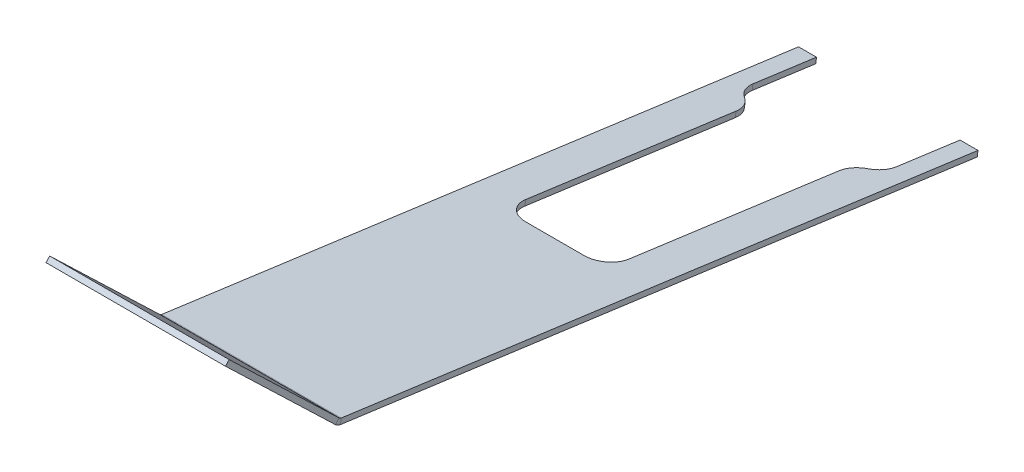
ISO-10303-21;
HEADER;
FILE_DESCRIPTION(('STEP AP214'),'2;1');
FILE_NAME('part.step','',(''),(''),'','','');
FILE_SCHEMA(('AUTOMOTIVE_DESIGN { 1 0 10303 214 1 1 1 1 }'));
ENDSEC;
DATA;
#1=APPLICATION_CONTEXT('core data for automotive mechanical design processes');
#2=APPLICATION_PROTOCOL_DEFINITION('international standard','automotive_design',2000,#1);
#3=PRODUCT_CONTEXT('',#1,'mechanical');
#4=PRODUCT('Part','Part','',(#3));
#5=PRODUCT_RELATED_PRODUCT_CATEGORY('part','',(#4));
#6=PRODUCT_DEFINITION_FORMATION('','',#4);
#7=PRODUCT_DEFINITION_CONTEXT('part definition',#1,'design');
#8=PRODUCT_DEFINITION('design','',#6,#7);
#9=PRODUCT_DEFINITION_SHAPE('','',#8);
#10=(LENGTH_UNIT() NAMED_UNIT(*) SI_UNIT(.MILLI.,.METRE.));
#11=(NAMED_UNIT(*) PLANE_ANGLE_UNIT() SI_UNIT($,.RADIAN.));
#12=(NAMED_UNIT(*) SI_UNIT($,.STERADIAN.) SOLID_ANGLE_UNIT());
#13=UNCERTAINTY_MEASURE_WITH_UNIT(LENGTH_MEASURE(1.E-05),#10,'distance_accuracy_value','');
#14=(GEOMETRIC_REPRESENTATION_CONTEXT(3) GLOBAL_UNCERTAINTY_ASSIGNED_CONTEXT((#13)) GLOBAL_UNIT_ASSIGNED_CONTEXT((#10,
#11,#12)) REPRESENTATION_CONTEXT('',''));
#15=CARTESIAN_POINT('',(0.,0.,0.));
#16=DIRECTION('',(0.,0.,1.));
#17=DIRECTION('',(1.,0.,0.));
#18=AXIS2_PLACEMENT_3D('',#15,#16,#17);
#19=CARTESIAN_POINT('',(100.,-120.,-125.));
#20=DIRECTION('',(0.,0.990872403181699,-0.134803117964402));
#21=DIRECTION('',(0.,0.134803117964402,0.990872403181699));
#22=AXIS2_PLACEMENT_3D('',#19,#20,#21);
#23=PLANE('',#22);
#24=DIRECTION('',(-1.,0.,0.));
#25=VECTOR('',#24,1.);
#26=CARTESIAN_POINT('',(100.,-216.999999999994,-838.));
#27=LINE('',#26,#25);
#28=CARTESIAN_POINT('',(-80.,-216.999999999994,-838.));
#29=VERTEX_POINT('',#28);
#30=CARTESIAN_POINT('',(-100.,-216.999999999994,-838.));
#31=VERTEX_POINT('',#30);
#32=EDGE_CURVE('E322',#29,#31,#27,.T.);
#33=ORIENTED_EDGE('',*,*,#32,.F.);
#34=DIRECTION('',(0.,0.134803117964402,0.990872403181699));
#35=VECTOR('',#34,1.);
#36=CARTESIAN_POINT('',(-80.,-120.,-125.));
#37=LINE('',#36,#35);
#38=CARTESIAN_POINT('',(-80.,-207.361577065539,-767.152623172509));
#39=VERTEX_POINT('',#38);
#40=EDGE_CURVE('E242',#29,#39,#37,.T.);
#41=ORIENTED_EDGE('',*,*,#40,.T.);
#42=CARTESIAN_POINT('',(-55.,-207.361577065539,-767.152623172508));
#43=DIRECTION('',(0.,0.990872403181699,-0.134803117964402));
#44=DIRECTION('',(0.,0.134803117964402,0.990872403181699));
#45=AXIS2_PLACEMENT_3D('',#42,#43,#44);
#46=CIRCLE('',#45,25.);
#47=CARTESIAN_POINT('',(-68.75,-204.547007079787,-746.464082967958));
#48=VERTEX_POINT('',#47);
#49=EDGE_CURVE('E245',#39,#48,#46,.T.);
#50=ORIENTED_EDGE('',*,*,#49,.T.);
#51=CARTESIAN_POINT('',(-82.5,-201.732437094035,-725.775542763407));
#52=DIRECTION('',(0.,0.990872403181699,-0.134803117964402));
#53=DIRECTION('',(0.,0.134803117964402,0.990872403181699));
#54=AXIS2_PLACEMENT_3D('',#51,#52,#53);
#55=CIRCLE('',#54,25.);
#56=CARTESIAN_POINT('',(-57.5,-201.732437094035,-725.775542763407));
#57=VERTEX_POINT('',#56);
#58=EDGE_CURVE('E248',#57,#48,#55,.T.);
#59=ORIENTED_EDGE('',*,*,#58,.F.);
#60=DIRECTION('',(0.,0.134803117964402,0.990872403181699));
#61=VECTOR('',#60,1.);
#62=CARTESIAN_POINT('',(-57.4999999999999,-120.,-125.));
#63=LINE('',#62,#61);
#64=CARTESIAN_POINT('',(-57.5,-169.818908712453,-491.194658886405));
#65=VERTEX_POINT('',#64);
#66=EDGE_CURVE('E182',#57,#65,#63,.T.);
#67=ORIENTED_EDGE('',*,*,#66,.T.);
#68=CARTESIAN_POINT('',(-32.5,-169.818908712453,-491.194658886405));
#69=DIRECTION('',(0.,0.990872403181699,-0.134803117964402));
#70=DIRECTION('',(0.,0.134803117964402,0.990872403181699));
#71=AXIS2_PLACEMENT_3D('',#68,#69,#70);
#72=CIRCLE('',#71,25.);
#73=CARTESIAN_POINT('',(-32.4999999999999,-166.448830763343,-466.422848806863));
#74=VERTEX_POINT('',#73);
#75=EDGE_CURVE('E344',#65,#74,#72,.T.);
#76=ORIENTED_EDGE('',*,*,#75,.T.);
#77=DIRECTION('',(1.,0.,0.));
#78=VECTOR('',#77,1.);
#79=CARTESIAN_POINT('',(100.,-166.448830763343,-466.422848806863));
#80=LINE('',#79,#78);
#81=CARTESIAN_POINT('',(32.5,-166.448830763343,-466.422848806863));
#82=VERTEX_POINT('',#81);
#83=EDGE_CURVE('E251',#74,#82,#80,.T.);
#84=ORIENTED_EDGE('',*,*,#83,.T.);
#85=CARTESIAN_POINT('',(32.5,-169.818908712453,-491.194658886405));
#86=DIRECTION('',(0.,0.990872403181699,-0.134803117964402));
#87=DIRECTION('',(0.,0.134803117964402,0.990872403181699));
#88=AXIS2_PLACEMENT_3D('',#85,#86,#87);
#89=CIRCLE('',#88,25.);
#90=CARTESIAN_POINT('',(57.5,-169.818908712453,-491.194658886405));
#91=VERTEX_POINT('',#90);
#92=EDGE_CURVE('E11',#82,#91,#89,.T.);
#93=ORIENTED_EDGE('',*,*,#92,.T.);
#94=DIRECTION('',(0.,0.134803117964402,0.990872403181699));
#95=VECTOR('',#94,1.);
#96=CARTESIAN_POINT('',(57.5000000000001,-120.,-125.));
#97=LINE('',#96,#95);
#98=CARTESIAN_POINT('',(57.5,-201.732437094035,-725.775542763407));
#99=VERTEX_POINT('',#98);
#100=EDGE_CURVE('E253',#99,#91,#97,.T.);
#101=ORIENTED_EDGE('',*,*,#100,.F.);
#102=CARTESIAN_POINT('',(82.5,-201.732437094035,-725.775542763407));
#103=DIRECTION('',(0.,0.990872403181699,-0.134803117964402));
#104=DIRECTION('',(0.,0.134803117964402,0.990872403181699));
#105=AXIS2_PLACEMENT_3D('',#102,#103,#104);
#106=CIRCLE('',#105,25.0000000000001);
#107=CARTESIAN_POINT('',(68.75,-204.547007079787,-746.464082967958));
#108=VERTEX_POINT('',#107);
#109=EDGE_CURVE('E185',#99,#108,#106,.F.);
#110=ORIENTED_EDGE('',*,*,#109,.T.);
#111=CARTESIAN_POINT('',(55.,-207.361577065539,-767.152623172508));
#112=DIRECTION('',(0.,0.990872403181699,-0.134803117964402));
#113=DIRECTION('',(0.,0.134803117964402,0.990872403181699));
#114=AXIS2_PLACEMENT_3D('',#111,#112,#113);
#115=CIRCLE('',#114,25.);
#116=CARTESIAN_POINT('',(80.,-207.361577065539,-767.152623172508));
#117=VERTEX_POINT('',#116);
#118=EDGE_CURVE('E238',#117,#108,#115,.F.);
#119=ORIENTED_EDGE('',*,*,#118,.F.);
#120=DIRECTION('',(0.,0.134803117964402,0.990872403181699));
#121=VECTOR('',#120,1.);
#122=CARTESIAN_POINT('',(80.,-120.,-125.));
#123=LINE('',#122,#121);
#124=CARTESIAN_POINT('',(80.,-216.999999999994,-838.));
#125=VERTEX_POINT('',#124);
#126=EDGE_CURVE('E240',#125,#117,#123,.T.);
#127=ORIENTED_EDGE('',*,*,#126,.F.);
#128=CARTESIAN_POINT('',(100.,-216.999999999994,-838.));
#129=VERTEX_POINT('',#128);
#130=EDGE_CURVE('E323',#129,#125,#27,.T.);
#131=ORIENTED_EDGE('',*,*,#130,.F.);
#132=DIRECTION('',(0.,-0.134803117964402,-0.990872403181699));
#133=VECTOR('',#132,1.);
#134=CARTESIAN_POINT('',(100.,-120.,-125.));
#135=LINE('',#134,#133);
#136=CARTESIAN_POINT('',(100.,-120.439089748205,-128.22753598423));
#137=VERTEX_POINT('',#136);
#138=EDGE_CURVE('E256',#137,#129,#135,.T.);
#139=ORIENTED_EDGE('',*,*,#138,.F.);
#140=DIRECTION('',(-1.,0.,0.));
#141=VECTOR('',#140,1.);
#142=CARTESIAN_POINT('',(100.,-120.439089748205,-128.22753598423));
#143=LINE('',#142,#141);
#144=CARTESIAN_POINT('',(-100.,-120.439089748205,-128.22753598423));
#145=VERTEX_POINT('',#144);
#146=EDGE_CURVE('E280',#137,#145,#143,.T.);
#147=ORIENTED_EDGE('',*,*,#146,.T.);
#148=DIRECTION('',(0.,-0.134803117964402,-0.990872403181699));
#149=VECTOR('',#148,1.);
#150=CARTESIAN_POINT('',(-100.,-120.,-125.));
#151=LINE('',#150,#149);
#152=EDGE_CURVE('E255',#145,#31,#151,.T.);
#153=ORIENTED_EDGE('',*,*,#152,.T.);
#154=EDGE_LOOP('',(#33,#41,#50,#59,#67,#76,#84,#93,#101,#110,#119,#127,#131,#139,#147,#153));
#155=FACE_BOUND('',#154,.T.);
#156=ADVANCED_FACE('F38',(#155),#23,.F.);
#157=CARTESIAN_POINT('',(100.,-211.054765580903,-838.808818707786));
#158=DIRECTION('',(0.,-0.134803117964414,-0.990872403181697));
#159=DIRECTION('',(0.,0.990872403181697,-0.134803117964414));
#160=AXIS2_PLACEMENT_3D('',#157,#158,#159);
#161=PLANE('',#160);
#162=ORIENTED_EDGE('',*,*,#130,.T.);
#163=DIRECTION('',(0.,0.990872403181699,-0.134803117964402));
#164=VECTOR('',#163,1.);
#165=CARTESIAN_POINT('',(80.,-328.933913762255,-822.771964046369));
#166=LINE('',#165,#164);
#167=CARTESIAN_POINT('',(80.,-211.054765580903,-838.808818707786));
#168=VERTEX_POINT('',#167);
#169=EDGE_CURVE('E228',#125,#168,#166,.T.);
#170=ORIENTED_EDGE('',*,*,#169,.T.);
#171=DIRECTION('',(-1.,0.,0.));
#172=VECTOR('',#171,1.);
#173=CARTESIAN_POINT('',(100.,-211.054765580903,-838.808818707786));
#174=LINE('',#173,#172);
#175=CARTESIAN_POINT('',(100.,-211.054765580903,-838.808818707786));
#176=VERTEX_POINT('',#175);
#177=EDGE_CURVE('E319',#176,#168,#174,.T.);
#178=ORIENTED_EDGE('',*,*,#177,.F.);
#179=DIRECTION('',(0.,-0.990872403181697,0.134803117964414));
#180=VECTOR('',#179,1.);
#181=CARTESIAN_POINT('',(100.,-211.054765580903,-838.808818707786));
#182=LINE('',#181,#180);
#183=EDGE_CURVE('E258',#176,#129,#182,.T.);
#184=ORIENTED_EDGE('',*,*,#183,.T.);
#185=EDGE_LOOP('',(#162,#170,#178,#184));
#186=FACE_BOUND('',#185,.T.);
#187=ADVANCED_FACE('F369',(#186),#161,.T.);
#188=CARTESIAN_POINT('',(100.,-114.05476558091,-125.808818707786));
#189=DIRECTION('',(0.,0.990872403181699,-0.134803117964402));
#190=DIRECTION('',(0.,0.134803117964402,0.990872403181699));
#191=AXIS2_PLACEMENT_3D('',#188,#189,#190);
#192=PLANE('',#191);
#193=DIRECTION('',(0.,0.134803117964402,0.990872403181699));
#194=VECTOR('',#193,1.);
#195=CARTESIAN_POINT('',(-80.,-211.054765580903,-838.808818707786));
#196=LINE('',#195,#194);
#197=CARTESIAN_POINT('',(-80.,-211.054765580903,-838.808818707786));
#198=VERTEX_POINT('',#197);
#199=CARTESIAN_POINT('',(-80.,-201.416342646449,-767.961441880295));
#200=VERTEX_POINT('',#199);
#201=EDGE_CURVE('E209',#198,#200,#196,.T.);
#202=ORIENTED_EDGE('',*,*,#201,.F.);
#203=CARTESIAN_POINT('',(-100.,-211.054765580903,-838.808818707786));
#204=VERTEX_POINT('',#203);
#205=EDGE_CURVE('E318',#198,#204,#174,.T.);
#206=ORIENTED_EDGE('',*,*,#205,.T.);
#207=DIRECTION('',(0.,-0.134803117964402,-0.990872403181699));
#208=VECTOR('',#207,1.);
#209=CARTESIAN_POINT('',(-100.,-114.05476558091,-125.808818707786));
#210=LINE('',#209,#208);
#211=CARTESIAN_POINT('',(-100.,-114.493855329115,-129.036354692016));
#212=VERTEX_POINT('',#211);
#213=EDGE_CURVE('E286',#212,#204,#210,.T.);
#214=ORIENTED_EDGE('',*,*,#213,.F.);
#215=DIRECTION('',(-1.,0.,0.));
#216=VECTOR('',#215,1.);
#217=CARTESIAN_POINT('',(100.,-114.493855329115,-129.036354692016));
#218=LINE('',#217,#216);
#219=CARTESIAN_POINT('',(100.,-114.493855329115,-129.036354692016));
#220=VERTEX_POINT('',#219);
#221=EDGE_CURVE('E315',#220,#212,#218,.T.);
#222=ORIENTED_EDGE('',*,*,#221,.F.);
#223=DIRECTION('',(0.,-0.134803117964402,-0.990872403181699));
#224=VECTOR('',#223,1.);
#225=CARTESIAN_POINT('',(100.,-114.05476558091,-125.808818707786));
#226=LINE('',#225,#224);
#227=EDGE_CURVE('E262',#220,#176,#226,.T.);
#228=ORIENTED_EDGE('',*,*,#227,.T.);
#229=ORIENTED_EDGE('',*,*,#177,.T.);
#230=DIRECTION('',(0.,0.134803117964402,0.990872403181699));
#231=VECTOR('',#230,1.);
#232=CARTESIAN_POINT('',(80.,-211.054765580903,-838.808818707786));
#233=LINE('',#232,#231);
#234=CARTESIAN_POINT('',(80.,-201.416342646449,-767.961441880295));
#235=VERTEX_POINT('',#234);
#236=EDGE_CURVE('E212',#168,#235,#233,.T.);
#237=ORIENTED_EDGE('',*,*,#236,.T.);
#238=CARTESIAN_POINT('',(55.,-201.416342646449,-767.961441880295));
#239=DIRECTION('',(0.,-0.990872403181699,0.134803117964402));
#240=DIRECTION('',(0.,-0.134803117964402,-0.990872403181699));
#241=AXIS2_PLACEMENT_3D('',#238,#239,#240);
#242=CIRCLE('',#241,25.);
#243=CARTESIAN_POINT('',(68.75,-198.601772660697,-747.272901675744));
#244=VERTEX_POINT('',#243);
#245=EDGE_CURVE('E215',#235,#244,#242,.T.);
#246=ORIENTED_EDGE('',*,*,#245,.T.);
#247=CARTESIAN_POINT('',(82.5,-195.787202674944,-726.584361471194));
#248=DIRECTION('',(0.,-0.990872403181699,0.134803117964402));
#249=DIRECTION('',(0.,-0.134803117964402,-0.990872403181699));
#250=AXIS2_PLACEMENT_3D('',#247,#248,#249);
#251=CIRCLE('',#250,25.0000000000001);
#252=CARTESIAN_POINT('',(57.5,-195.787202674944,-726.584361471194));
#253=VERTEX_POINT('',#252);
#254=EDGE_CURVE('E218',#253,#244,#251,.T.);
#255=ORIENTED_EDGE('',*,*,#254,.F.);
#256=DIRECTION('',(0.,0.134803117964402,0.990872403181699));
#257=VECTOR('',#256,1.);
#258=CARTESIAN_POINT('',(57.5,-195.787202674944,-726.584361471194));
#259=LINE('',#258,#257);
#260=CARTESIAN_POINT('',(57.5,-163.873674293363,-492.003477594192));
#261=VERTEX_POINT('',#260);
#262=EDGE_CURVE('E204',#253,#261,#259,.T.);
#263=ORIENTED_EDGE('',*,*,#262,.T.);
#264=CARTESIAN_POINT('',(32.5,-163.873674293363,-492.003477594192));
#265=DIRECTION('',(0.,0.990872403181699,-0.134803117964402));
#266=DIRECTION('',(0.,0.134803117964402,0.990872403181699));
#267=AXIS2_PLACEMENT_3D('',#264,#265,#266);
#268=CIRCLE('',#267,25.);
#269=CARTESIAN_POINT('',(32.5,-160.503596344253,-467.231667514649));
#270=VERTEX_POINT('',#269);
#271=EDGE_CURVE('E46',#261,#270,#268,.F.);
#272=ORIENTED_EDGE('',*,*,#271,.T.);
#273=DIRECTION('',(1.,0.,0.));
#274=VECTOR('',#273,1.);
#275=CARTESIAN_POINT('',(-57.5,-160.503596344253,-467.231667514649));
#276=LINE('',#275,#274);
#277=CARTESIAN_POINT('',(-32.5,-160.503596344253,-467.231667514649));
#278=VERTEX_POINT('',#277);
#279=EDGE_CURVE('E201',#278,#270,#276,.T.);
#280=ORIENTED_EDGE('',*,*,#279,.F.);
#281=CARTESIAN_POINT('',(-32.5,-163.873674293363,-492.003477594192));
#282=DIRECTION('',(0.,0.990872403181699,-0.134803117964402));
#283=DIRECTION('',(0.,0.134803117964402,0.990872403181699));
#284=AXIS2_PLACEMENT_3D('',#281,#282,#283);
#285=CIRCLE('',#284,25.);
#286=CARTESIAN_POINT('',(-57.5,-163.873674293363,-492.003477594192));
#287=VERTEX_POINT('',#286);
#288=EDGE_CURVE('E200',#278,#287,#285,.F.);
#289=ORIENTED_EDGE('',*,*,#288,.T.);
#290=DIRECTION('',(0.,0.134803117964402,0.990872403181699));
#291=VECTOR('',#290,1.);
#292=CARTESIAN_POINT('',(-57.5,-195.787202674944,-726.584361471194));
#293=LINE('',#292,#291);
#294=CARTESIAN_POINT('',(-57.5,-195.787202674944,-726.584361471194));
#295=VERTEX_POINT('',#294);
#296=EDGE_CURVE('E179',#295,#287,#293,.T.);
#297=ORIENTED_EDGE('',*,*,#296,.F.);
#298=CARTESIAN_POINT('',(-82.5,-195.787202674944,-726.584361471194));
#299=DIRECTION('',(0.,0.990872403181699,-0.134803117964402));
#300=DIRECTION('',(0.,0.134803117964402,0.990872403181699));
#301=AXIS2_PLACEMENT_3D('',#298,#299,#300);
#302=CIRCLE('',#301,25.);
#303=CARTESIAN_POINT('',(-68.75,-198.601772660697,-747.272901675744));
#304=VERTEX_POINT('',#303);
#305=EDGE_CURVE('E189',#295,#304,#302,.T.);
#306=ORIENTED_EDGE('',*,*,#305,.T.);
#307=CARTESIAN_POINT('',(-55.,-201.416342646449,-767.961441880295));
#308=DIRECTION('',(0.,0.990872403181699,-0.134803117964402));
#309=DIRECTION('',(0.,0.134803117964402,0.990872403181699));
#310=AXIS2_PLACEMENT_3D('',#307,#308,#309);
#311=CIRCLE('',#310,25.);
#312=EDGE_CURVE('E195',#200,#304,#311,.T.);
#313=ORIENTED_EDGE('',*,*,#312,.F.);
#314=EDGE_LOOP('',(#202,#206,#214,#222,#228,#229,#237,#246,#255,#263,#272,#280,#289,#297,#306,#313));
#315=FACE_BOUND('',#314,.T.);
#316=ADVANCED_FACE('F198',(#315),#192,.T.);
#317=CARTESIAN_POINT('',(100.,-117.744238926698,-122.650248881977));
#318=DIRECTION('',(1.,0.,0.));
#319=DIRECTION('',(0.,0.,-1.));
#320=AXIS2_PLACEMENT_3D('',#317,#318,#319);
#321=PLANE('',#320);
#322=DIRECTION('',(0.,0.721387321030954,-0.692531828189711));
#323=VECTOR('',#322,1.);
#324=CARTESIAN_POINT('',(100.,-117.744238926698,-122.650248881977));
#325=LINE('',#324,#323);
#326=CARTESIAN_POINT('',(100.,-117.744238926698,-122.650248881977));
#327=VERTEX_POINT('',#326);
#328=CARTESIAN_POINT('',(100.,-113.415915000512,-126.805439851115));
#329=VERTEX_POINT('',#328);
#330=EDGE_CURVE('E332',#327,#329,#325,.T.);
#331=ORIENTED_EDGE('',*,*,#330,.F.);
#332=CARTESIAN_POINT('',(100.,-110.530365716388,-129.575567163874));
#333=DIRECTION('',(-1.,0.,0.));
#334=DIRECTION('',(0.,0.,1.));
#335=AXIS2_PLACEMENT_3D('',#332,#333,#334);
#336=CIRCLE('',#335,10.);
#337=EDGE_CURVE('E277',#327,#137,#336,.F.);
#338=ORIENTED_EDGE('',*,*,#337,.T.);
#339=DIRECTION('',(0.,-0.990872403181699,0.1348031179644));
#340=VECTOR('',#339,1.);
#341=CARTESIAN_POINT('',(100.,-114.493855329115,-129.036354692016));
#342=LINE('',#341,#340);
#343=EDGE_CURVE('E330',#220,#137,#342,.T.);
#344=ORIENTED_EDGE('',*,*,#343,.F.);
#345=CARTESIAN_POINT('',(100.,-110.530365716388,-129.575567163874));
#346=DIRECTION('',(1.,0.,0.));
#347=DIRECTION('',(0.,0.,-1.));
#348=AXIS2_PLACEMENT_3D('',#345,#346,#347);
#349=CIRCLE('',#348,4.);
#350=EDGE_CURVE('E265',#329,#220,#349,.T.);
#351=ORIENTED_EDGE('',*,*,#350,.F.);
#352=EDGE_LOOP('',(#331,#338,#344,#351));
#353=FACE_BOUND('',#352,.T.);
#354=ADVANCED_FACE('F382',(#353),#321,.T.);
#355=CARTESIAN_POINT('',(100.,-114.493855329115,-129.036354692016));
#356=DIRECTION('',(1.,0.,0.));
#357=DIRECTION('',(0.,0.,-1.));
#358=AXIS2_PLACEMENT_3D('',#355,#356,#357);
#359=PLANE('',#358);
#360=DIRECTION('',(0.,-0.692531828189713,-0.721387321030952));
#361=VECTOR('',#360,1.);
#362=CARTESIAN_POINT('',(100.,0.,0.));
#363=LINE('',#362,#361);
#364=CARTESIAN_POINT('',(100.,0.,0.));
#365=VERTEX_POINT('',#364);
#366=EDGE_CURVE('E274',#365,#327,#363,.T.);
#367=ORIENTED_EDGE('',*,*,#366,.T.);
#368=ORIENTED_EDGE('',*,*,#330,.T.);
#369=DIRECTION('',(0.,-0.692531828189713,-0.721387321030952));
#370=VECTOR('',#369,1.);
#371=CARTESIAN_POINT('',(100.,4.32832392618571,-4.15519096913828));
#372=LINE('',#371,#370);
#373=CARTESIAN_POINT('',(100.,4.32832392618571,-4.15519096913828));
#374=VERTEX_POINT('',#373);
#375=EDGE_CURVE('E268',#374,#329,#372,.T.);
#376=ORIENTED_EDGE('',*,*,#375,.F.);
#377=DIRECTION('',(0.,0.721387321030952,-0.692531828189713));
#378=VECTOR('',#377,1.);
#379=CARTESIAN_POINT('',(100.,0.,0.));
#380=LINE('',#379,#378);
#381=EDGE_CURVE('E271',#365,#374,#380,.T.);
#382=ORIENTED_EDGE('',*,*,#381,.F.);
#383=EDGE_LOOP('',(#367,#368,#376,#382));
#384=FACE_BOUND('',#383,.T.);
#385=ADVANCED_FACE('F389',(#384),#359,.T.);
#386=CARTESIAN_POINT('',(-100.,-120.439089748205,-128.22753598423));
#387=DIRECTION('',(-1.,0.,0.));
#388=DIRECTION('',(0.,0.,1.));
#389=AXIS2_PLACEMENT_3D('',#386,#387,#388);
#390=PLANE('',#389);
#391=DIRECTION('',(0.,0.990872403181699,-0.1348031179644));
#392=VECTOR('',#391,1.);
#393=CARTESIAN_POINT('',(-100.,-120.439089748205,-128.22753598423));
#394=LINE('',#393,#392);
#395=EDGE_CURVE('E328',#145,#212,#394,.T.);
#396=ORIENTED_EDGE('',*,*,#395,.F.);
#397=CARTESIAN_POINT('',(-100.,-110.530365716388,-129.575567163874));
#398=DIRECTION('',(-1.,0.,0.));
#399=DIRECTION('',(0.,0.,1.));
#400=AXIS2_PLACEMENT_3D('',#397,#398,#399);
#401=CIRCLE('',#400,10.);
#402=CARTESIAN_POINT('',(-100.,-117.744238926698,-122.650248881977));
#403=VERTEX_POINT('',#402);
#404=EDGE_CURVE('E259',#403,#145,#401,.F.);
#405=ORIENTED_EDGE('',*,*,#404,.F.);
#406=DIRECTION('',(0.,-0.721387321030954,0.692531828189711));
#407=VECTOR('',#406,1.);
#408=CARTESIAN_POINT('',(-100.,-113.415915000512,-126.805439851115));
#409=LINE('',#408,#407);
#410=CARTESIAN_POINT('',(-100.,-113.415915000512,-126.805439851115));
#411=VERTEX_POINT('',#410);
#412=EDGE_CURVE('E326',#411,#403,#409,.T.);
#413=ORIENTED_EDGE('',*,*,#412,.F.);
#414=CARTESIAN_POINT('',(-100.,-110.530365716388,-129.575567163874));
#415=DIRECTION('',(1.,0.,0.));
#416=DIRECTION('',(0.,0.,-1.));
#417=AXIS2_PLACEMENT_3D('',#414,#415,#416);
#418=CIRCLE('',#417,4.);
#419=EDGE_CURVE('E289',#411,#212,#418,.T.);
#420=ORIENTED_EDGE('',*,*,#419,.T.);
#421=EDGE_LOOP('',(#396,#405,#413,#420));
#422=FACE_BOUND('',#421,.T.);
#423=ADVANCED_FACE('F434',(#422),#390,.T.);
#424=CARTESIAN_POINT('',(-100.,-113.415915000512,-126.805439851115));
#425=DIRECTION('',(-1.,0.,0.));
#426=DIRECTION('',(0.,0.,1.));
#427=AXIS2_PLACEMENT_3D('',#424,#425,#426);
#428=PLANE('',#427);
#429=ORIENTED_EDGE('',*,*,#152,.F.);
#430=ORIENTED_EDGE('',*,*,#395,.T.);
#431=ORIENTED_EDGE('',*,*,#213,.T.);
#432=DIRECTION('',(0.,-0.990872403181697,0.134803117964414));
#433=VECTOR('',#432,1.);
#434=CARTESIAN_POINT('',(-100.,-211.054765580903,-838.808818707786));
#435=LINE('',#434,#433);
#436=EDGE_CURVE('E283',#204,#31,#435,.T.);
#437=ORIENTED_EDGE('',*,*,#436,.T.);
#438=EDGE_LOOP('',(#429,#430,#431,#437));
#439=FACE_BOUND('',#438,.T.);
#440=ADVANCED_FACE('F405',(#439),#428,.T.);
#441=DIRECTION('',(0.,0.990872403181699,-0.134803117964402));
#442=VECTOR('',#441,1.);
#443=CARTESIAN_POINT('',(-80.,-328.933913762255,-822.771964046369));
#444=LINE('',#443,#442);
#445=EDGE_CURVE('E231',#29,#198,#444,.T.);
#446=ORIENTED_EDGE('',*,*,#445,.F.);
#447=ORIENTED_EDGE('',*,*,#32,.T.);
#448=ORIENTED_EDGE('',*,*,#436,.F.);
#449=ORIENTED_EDGE('',*,*,#205,.F.);
#450=EDGE_LOOP('',(#446,#447,#448,#449));
#451=FACE_BOUND('',#450,.T.);
#452=ADVANCED_FACE('F410',(#451),#161,.T.);
#453=CARTESIAN_POINT('',(100.,-110.530365716388,-129.575567163874));
#454=DIRECTION('',(-1.,0.,0.));
#455=DIRECTION('',(0.,0.,1.));
#456=AXIS2_PLACEMENT_3D('',#453,#454,#455);
#457=CYLINDRICAL_SURFACE('',#456,4.);
#458=ORIENTED_EDGE('',*,*,#419,.F.);
#459=DIRECTION('',(-1.,0.,0.));
#460=VECTOR('',#459,1.);
#461=CARTESIAN_POINT('',(100.,-113.415915000512,-126.805439851115));
#462=LINE('',#461,#460);
#463=EDGE_CURVE('E312',#329,#411,#462,.T.);
#464=ORIENTED_EDGE('',*,*,#463,.F.);
#465=ORIENTED_EDGE('',*,*,#350,.T.);
#466=ORIENTED_EDGE('',*,*,#221,.T.);
#467=EDGE_LOOP('',(#458,#464,#465,#466));
#468=FACE_BOUND('',#467,.T.);
#469=ADVANCED_FACE('F378',(#468),#457,.F.);
#470=CARTESIAN_POINT('',(100.,4.32832392618571,-4.15519096913828));
#471=DIRECTION('',(0.,0.721387321030952,-0.692531828189713));
#472=DIRECTION('',(0.,0.692531828189713,0.721387321030952));
#473=AXIS2_PLACEMENT_3D('',#470,#471,#472);
#474=PLANE('',#473);
#475=DIRECTION('',(0.,-0.692531828189713,-0.721387321030952));
#476=VECTOR('',#475,1.);
#477=CARTESIAN_POINT('',(-100.,4.32832392618571,-4.15519096913828));
#478=LINE('',#477,#476);
#479=CARTESIAN_POINT('',(-100.,4.32832392618571,-4.15519096913828));
#480=VERTEX_POINT('',#479);
#481=EDGE_CURVE('E292',#480,#411,#478,.T.);
#482=ORIENTED_EDGE('',*,*,#481,.F.);
#483=DIRECTION('',(-1.,0.,0.));
#484=VECTOR('',#483,1.);
#485=CARTESIAN_POINT('',(100.,4.32832392618571,-4.15519096913828));
#486=LINE('',#485,#484);
#487=EDGE_CURVE('E310',#374,#480,#486,.T.);
#488=ORIENTED_EDGE('',*,*,#487,.F.);
#489=ORIENTED_EDGE('',*,*,#375,.T.);
#490=ORIENTED_EDGE('',*,*,#463,.T.);
#491=EDGE_LOOP('',(#482,#488,#489,#490));
#492=FACE_BOUND('',#491,.T.);
#493=ADVANCED_FACE('F386',(#492),#474,.T.);
#494=CARTESIAN_POINT('',(100.,0.,0.));
#495=DIRECTION('',(0.,0.692531828189713,0.721387321030952));
#496=DIRECTION('',(0.,-0.721387321030952,0.692531828189713));
#497=AXIS2_PLACEMENT_3D('',#494,#495,#496);
#498=PLANE('',#497);
#499=DIRECTION('',(0.,0.721387321030952,-0.692531828189713));
#500=VECTOR('',#499,1.);
#501=CARTESIAN_POINT('',(-100.,0.,0.));
#502=LINE('',#501,#500);
#503=CARTESIAN_POINT('',(-100.,0.,0.));
#504=VERTEX_POINT('',#503);
#505=EDGE_CURVE('E295',#504,#480,#502,.T.);
#506=ORIENTED_EDGE('',*,*,#505,.F.);
#507=DIRECTION('',(-1.,0.,0.));
#508=VECTOR('',#507,1.);
#509=CARTESIAN_POINT('',(100.,0.,0.));
#510=LINE('',#509,#508);
#511=EDGE_CURVE('E308',#365,#504,#510,.T.);
#512=ORIENTED_EDGE('',*,*,#511,.F.);
#513=ORIENTED_EDGE('',*,*,#381,.T.);
#514=ORIENTED_EDGE('',*,*,#487,.T.);
#515=EDGE_LOOP('',(#506,#512,#513,#514));
#516=FACE_BOUND('',#515,.T.);
#517=ADVANCED_FACE('F392',(#516),#498,.T.);
#518=CARTESIAN_POINT('',(100.,0.,0.));
#519=DIRECTION('',(0.,0.721387321030952,-0.692531828189713));
#520=DIRECTION('',(0.,0.692531828189713,0.721387321030952));
#521=AXIS2_PLACEMENT_3D('',#518,#519,#520);
#522=PLANE('',#521);
#523=DIRECTION('',(0.,-0.692531828189713,-0.721387321030952));
#524=VECTOR('',#523,1.);
#525=CARTESIAN_POINT('',(-100.,0.,0.));
#526=LINE('',#525,#524);
#527=EDGE_CURVE('E298',#504,#403,#526,.T.);
#528=ORIENTED_EDGE('',*,*,#527,.T.);
#529=DIRECTION('',(-1.,0.,0.));
#530=VECTOR('',#529,1.);
#531=CARTESIAN_POINT('',(100.,-117.744238926698,-122.650248881977));
#532=LINE('',#531,#530);
#533=EDGE_CURVE('E305',#327,#403,#532,.T.);
#534=ORIENTED_EDGE('',*,*,#533,.F.);
#535=ORIENTED_EDGE('',*,*,#366,.F.);
#536=ORIENTED_EDGE('',*,*,#511,.T.);
#537=EDGE_LOOP('',(#528,#534,#535,#536));
#538=FACE_BOUND('',#537,.T.);
#539=ADVANCED_FACE('F397',(#538),#522,.F.);
#540=CARTESIAN_POINT('',(100.,-110.530365716388,-129.575567163874));
#541=DIRECTION('',(-1.,0.,0.));
#542=DIRECTION('',(0.,0.,1.));
#543=AXIS2_PLACEMENT_3D('',#540,#541,#542);
#544=CYLINDRICAL_SURFACE('',#543,10.);
#545=ORIENTED_EDGE('',*,*,#404,.T.);
#546=ORIENTED_EDGE('',*,*,#146,.F.);
#547=ORIENTED_EDGE('',*,*,#337,.F.);
#548=ORIENTED_EDGE('',*,*,#533,.T.);
#549=EDGE_LOOP('',(#545,#546,#547,#548));
#550=FACE_BOUND('',#549,.T.);
#551=ADVANCED_FACE('F402',(#550),#544,.T.);
#552=CARTESIAN_POINT('',(100.,-110.530365716388,-129.575567163874));
#553=DIRECTION('',(1.,0.,0.));
#554=DIRECTION('',(0.,0.,-1.));
#555=AXIS2_PLACEMENT_3D('',#552,#553,#554);
#556=PLANE('',#555);
#557=ORIENTED_EDGE('',*,*,#138,.T.);
#558=ORIENTED_EDGE('',*,*,#183,.F.);
#559=ORIENTED_EDGE('',*,*,#227,.F.);
#560=ORIENTED_EDGE('',*,*,#343,.T.);
#561=EDGE_LOOP('',(#557,#558,#559,#560));
#562=FACE_BOUND('',#561,.T.);
#563=ADVANCED_FACE('F373',(#562),#556,.T.);
#564=CARTESIAN_POINT('',(-100.,-110.530365716388,-129.575567163874));
#565=DIRECTION('',(1.,0.,0.));
#566=DIRECTION('',(0.,0.,-1.));
#567=AXIS2_PLACEMENT_3D('',#564,#565,#566);
#568=PLANE('',#567);
#569=ORIENTED_EDGE('',*,*,#481,.T.);
#570=ORIENTED_EDGE('',*,*,#412,.T.);
#571=ORIENTED_EDGE('',*,*,#527,.F.);
#572=ORIENTED_EDGE('',*,*,#505,.T.);
#573=EDGE_LOOP('',(#569,#570,#571,#572));
#574=FACE_BOUND('',#573,.T.);
#575=ADVANCED_FACE('F494',(#574),#568,.F.);
#576=CARTESIAN_POINT('',(57.5,-313.666350856296,-710.547506809777));
#577=DIRECTION('',(-1.,0.,0.));
#578=DIRECTION('',(0.,0.,1.));
#579=AXIS2_PLACEMENT_3D('',#576,#577,#578);
#580=PLANE('',#579);
#581=ORIENTED_EDGE('',*,*,#100,.T.);
#582=DIRECTION('',(0.,0.990872403181699,-0.134803117964402));
#583=VECTOR('',#582,1.);
#584=CARTESIAN_POINT('',(57.5,-281.752822474715,-475.966622932775));
#585=LINE('',#584,#583);
#586=EDGE_CURVE('E341',#91,#261,#585,.T.);
#587=ORIENTED_EDGE('',*,*,#586,.T.);
#588=ORIENTED_EDGE('',*,*,#262,.F.);
#589=DIRECTION('',(0.,0.990872403181699,-0.134803117964402));
#590=VECTOR('',#589,1.);
#591=CARTESIAN_POINT('',(57.5,-313.666350856296,-710.547506809777));
#592=LINE('',#591,#590);
#593=EDGE_CURVE('E221',#99,#253,#592,.T.);
#594=ORIENTED_EDGE('',*,*,#593,.F.);
#595=EDGE_LOOP('',(#581,#587,#588,#594));
#596=FACE_BOUND('',#595,.T.);
#597=ADVANCED_FACE('F352',(#596),#580,.T.);
#598=CARTESIAN_POINT('',(-57.5,-278.382744525605,-451.194812853232));
#599=DIRECTION('',(0.,0.134803117964402,0.990872403181699));
#600=DIRECTION('',(0.,-0.990872403181699,0.134803117964402));
#601=AXIS2_PLACEMENT_3D('',#598,#599,#600);
#602=PLANE('',#601);
#603=ORIENTED_EDGE('',*,*,#83,.F.);
#604=DIRECTION('',(0.,0.990872403181699,-0.134803117964402));
#605=VECTOR('',#604,1.);
#606=CARTESIAN_POINT('',(-32.5,-160.503596344253,-467.231667514649));
#607=LINE('',#606,#605);
#608=EDGE_CURVE('E336',#74,#278,#607,.T.);
#609=ORIENTED_EDGE('',*,*,#608,.T.);
#610=ORIENTED_EDGE('',*,*,#279,.T.);
#611=DIRECTION('',(0.,0.990872403181699,-0.134803117964402));
#612=VECTOR('',#611,1.);
#613=CARTESIAN_POINT('',(32.5,-278.382744525605,-451.194812853232));
#614=LINE('',#613,#612);
#615=EDGE_CURVE('E334',#270,#82,#614,.F.);
#616=ORIENTED_EDGE('',*,*,#615,.T.);
#617=EDGE_LOOP('',(#603,#609,#610,#616));
#618=FACE_BOUND('',#617,.T.);
#619=ADVANCED_FACE('F349',(#618),#602,.F.);
#620=CARTESIAN_POINT('',(-57.5,-313.666350856296,-710.547506809777));
#621=DIRECTION('',(-1.,0.,0.));
#622=DIRECTION('',(0.,0.,1.));
#623=AXIS2_PLACEMENT_3D('',#620,#621,#622);
#624=PLANE('',#623);
#625=ORIENTED_EDGE('',*,*,#296,.T.);
#626=DIRECTION('',(0.,0.990872403181699,-0.134803117964402));
#627=VECTOR('',#626,1.);
#628=CARTESIAN_POINT('',(-57.5,-169.818908712453,-491.194658886405));
#629=LINE('',#628,#627);
#630=EDGE_CURVE('E339',#287,#65,#629,.F.);
#631=ORIENTED_EDGE('',*,*,#630,.T.);
#632=ORIENTED_EDGE('',*,*,#66,.F.);
#633=DIRECTION('',(0.,0.990872403181699,-0.134803117964402));
#634=VECTOR('',#633,1.);
#635=CARTESIAN_POINT('',(-57.5,-313.666350856296,-710.547506809777));
#636=LINE('',#635,#634);
#637=EDGE_CURVE('E175',#57,#295,#636,.T.);
#638=ORIENTED_EDGE('',*,*,#637,.T.);
#639=EDGE_LOOP('',(#625,#631,#632,#638));
#640=FACE_BOUND('',#639,.T.);
#641=ADVANCED_FACE('F177',(#640),#624,.F.);
#642=CARTESIAN_POINT('',(-82.5,-313.666350856296,-710.547506809777));
#643=DIRECTION('',(0.,0.990872403181699,-0.134803117964402));
#644=DIRECTION('',(0.,0.134803117964402,0.990872403181699));
#645=AXIS2_PLACEMENT_3D('',#642,#643,#644);
#646=CYLINDRICAL_SURFACE('',#645,25.);
#647=ORIENTED_EDGE('',*,*,#58,.T.);
#648=DIRECTION('',(0.,0.990872403181699,-0.134803117964402));
#649=VECTOR('',#648,1.);
#650=CARTESIAN_POINT('',(-68.75,-316.480920842048,-731.236047014327));
#651=LINE('',#650,#649);
#652=EDGE_CURVE('E186',#48,#304,#651,.T.);
#653=ORIENTED_EDGE('',*,*,#652,.T.);
#654=ORIENTED_EDGE('',*,*,#305,.F.);
#655=ORIENTED_EDGE('',*,*,#637,.F.);
#656=EDGE_LOOP('',(#647,#653,#654,#655));
#657=FACE_BOUND('',#656,.T.);
#658=ADVANCED_FACE('F190',(#657),#646,.T.);
#659=CARTESIAN_POINT('',(-55.,-319.295490827801,-751.924587218878));
#660=DIRECTION('',(0.,0.990872403181699,-0.134803117964402));
#661=DIRECTION('',(0.,0.134803117964402,0.990872403181699));
#662=AXIS2_PLACEMENT_3D('',#659,#660,#661);
#663=CYLINDRICAL_SURFACE('',#662,25.);
#664=DIRECTION('',(0.,0.990872403181699,-0.134803117964402));
#665=VECTOR('',#664,1.);
#666=CARTESIAN_POINT('',(-80.,-319.295490827801,-751.924587218878));
#667=LINE('',#666,#665);
#668=EDGE_CURVE('E233',#39,#200,#667,.T.);
#669=ORIENTED_EDGE('',*,*,#668,.T.);
#670=ORIENTED_EDGE('',*,*,#312,.T.);
#671=ORIENTED_EDGE('',*,*,#652,.F.);
#672=ORIENTED_EDGE('',*,*,#49,.F.);
#673=EDGE_LOOP('',(#669,#670,#671,#672));
#674=FACE_BOUND('',#673,.T.);
#675=ADVANCED_FACE('F415',(#674),#663,.F.);
#676=CARTESIAN_POINT('',(-80.,-328.933913762255,-822.771964046369));
#677=DIRECTION('',(-1.,0.,0.));
#678=DIRECTION('',(0.,0.,1.));
#679=AXIS2_PLACEMENT_3D('',#676,#677,#678);
#680=PLANE('',#679);
#681=ORIENTED_EDGE('',*,*,#445,.T.);
#682=ORIENTED_EDGE('',*,*,#201,.T.);
#683=ORIENTED_EDGE('',*,*,#668,.F.);
#684=ORIENTED_EDGE('',*,*,#40,.F.);
#685=EDGE_LOOP('',(#681,#682,#683,#684));
#686=FACE_BOUND('',#685,.T.);
#687=ADVANCED_FACE('F413',(#686),#680,.F.);
#688=CARTESIAN_POINT('',(80.,-328.933913762255,-822.771964046369));
#689=DIRECTION('',(-1.,0.,0.));
#690=DIRECTION('',(0.,0.,1.));
#691=AXIS2_PLACEMENT_3D('',#688,#689,#690);
#692=PLANE('',#691);
#693=ORIENTED_EDGE('',*,*,#126,.T.);
#694=DIRECTION('',(0.,0.990872403181699,-0.134803117964402));
#695=VECTOR('',#694,1.);
#696=CARTESIAN_POINT('',(80.,-319.295490827801,-751.924587218878));
#697=LINE('',#696,#695);
#698=EDGE_CURVE('E226',#117,#235,#697,.T.);
#699=ORIENTED_EDGE('',*,*,#698,.T.);
#700=ORIENTED_EDGE('',*,*,#236,.F.);
#701=ORIENTED_EDGE('',*,*,#169,.F.);
#702=EDGE_LOOP('',(#693,#699,#700,#701));
#703=FACE_BOUND('',#702,.T.);
#704=ADVANCED_FACE('F365',(#703),#692,.T.);
#705=CARTESIAN_POINT('',(55.,-319.295490827801,-751.924587218878));
#706=DIRECTION('',(0.,0.990872403181699,-0.134803117964402));
#707=DIRECTION('',(0.,0.134803117964402,0.990872403181699));
#708=AXIS2_PLACEMENT_3D('',#705,#706,#707);
#709=CYLINDRICAL_SURFACE('',#708,25.);
#710=ORIENTED_EDGE('',*,*,#118,.T.);
#711=DIRECTION('',(0.,0.990872403181699,-0.134803117964402));
#712=VECTOR('',#711,1.);
#713=CARTESIAN_POINT('',(68.75,-316.480920842048,-731.236047014327));
#714=LINE('',#713,#712);
#715=EDGE_CURVE('E224',#108,#244,#714,.T.);
#716=ORIENTED_EDGE('',*,*,#715,.T.);
#717=ORIENTED_EDGE('',*,*,#245,.F.);
#718=ORIENTED_EDGE('',*,*,#698,.F.);
#719=EDGE_LOOP('',(#710,#716,#717,#718));
#720=FACE_BOUND('',#719,.T.);
#721=ADVANCED_FACE('F362',(#720),#709,.F.);
#722=CARTESIAN_POINT('',(82.5,-313.666350856296,-710.547506809777));
#723=DIRECTION('',(0.,0.990872403181699,-0.134803117964402));
#724=DIRECTION('',(0.,0.134803117964402,0.990872403181699));
#725=AXIS2_PLACEMENT_3D('',#722,#723,#724);
#726=CYLINDRICAL_SURFACE('',#725,25.0000000000001);
#727=ORIENTED_EDGE('',*,*,#593,.T.);
#728=ORIENTED_EDGE('',*,*,#254,.T.);
#729=ORIENTED_EDGE('',*,*,#715,.F.);
#730=ORIENTED_EDGE('',*,*,#109,.F.);
#731=EDGE_LOOP('',(#727,#728,#729,#730));
#732=FACE_BOUND('',#731,.T.);
#733=ADVANCED_FACE('F359',(#732),#726,.T.);
#734=CARTESIAN_POINT('',(-32.5,-281.752822474715,-475.966622932775));
#735=DIRECTION('',(0.,-0.990872403181699,0.134803117964402));
#736=DIRECTION('',(0.,-0.134803117964402,-0.990872403181699));
#737=AXIS2_PLACEMENT_3D('',#734,#735,#736);
#738=CYLINDRICAL_SURFACE('',#737,25.);
#739=ORIENTED_EDGE('',*,*,#75,.F.);
#740=ORIENTED_EDGE('',*,*,#630,.F.);
#741=ORIENTED_EDGE('',*,*,#288,.F.);
#742=ORIENTED_EDGE('',*,*,#608,.F.);
#743=EDGE_LOOP('',(#739,#740,#741,#742));
#744=FACE_BOUND('',#743,.T.);
#745=ADVANCED_FACE('F441',(#744),#738,.F.);
#746=CARTESIAN_POINT('',(32.5,-281.752822474715,-475.966622932775));
#747=DIRECTION('',(0.,0.990872403181699,-0.134803117964402));
#748=DIRECTION('',(0.,0.134803117964402,0.990872403181699));
#749=AXIS2_PLACEMENT_3D('',#746,#747,#748);
#750=CYLINDRICAL_SURFACE('',#749,25.);
#751=ORIENTED_EDGE('',*,*,#92,.F.);
#752=ORIENTED_EDGE('',*,*,#615,.F.);
#753=ORIENTED_EDGE('',*,*,#271,.F.);
#754=ORIENTED_EDGE('',*,*,#586,.F.);
#755=EDGE_LOOP('',(#751,#752,#753,#754));
#756=FACE_BOUND('',#755,.T.);
#757=ADVANCED_FACE('F40',(#756),#750,.F.);
#758=CLOSED_SHELL('',(#156,#187,#316,#354,#385,#423,#440,#452,#469,#493,#517,#539,#551,#563,
#575,#597,#619,#641,#658,#675,#687,#704,#721,#733,#745,#757));
#759=MANIFOLD_SOLID_BREP('B2',#758);
#760=ADVANCED_BREP_SHAPE_REPRESENTATION('',(#18,#759),#14);
#761=SHAPE_DEFINITION_REPRESENTATION(#9,#760);
ENDSEC;
END-ISO-10303-21;
